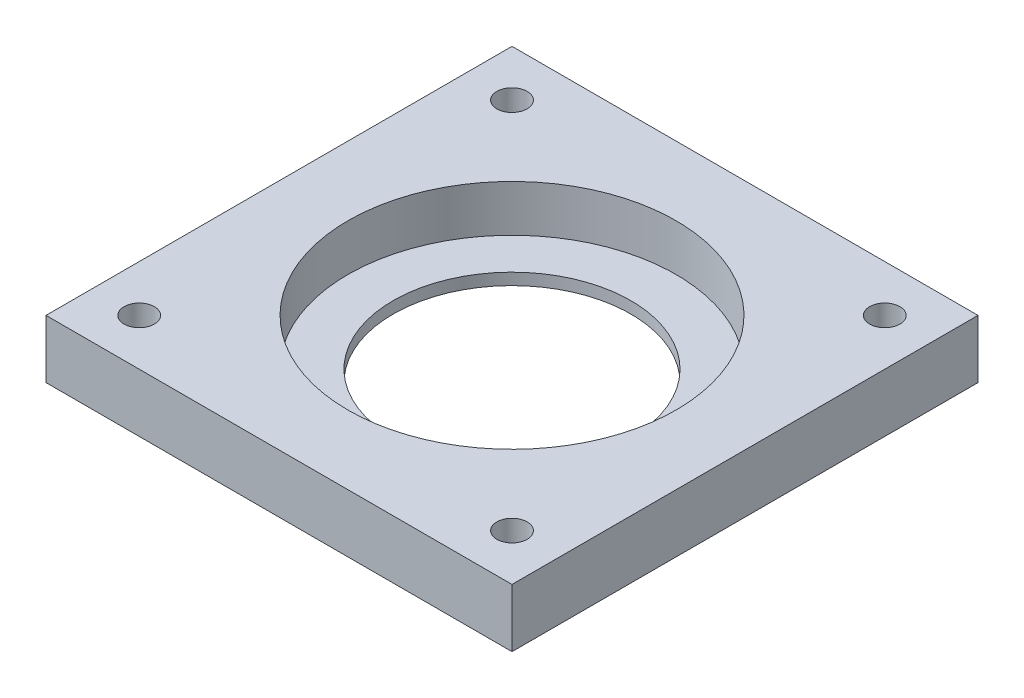
ISO-10303-21;
HEADER;
FILE_DESCRIPTION(('STEP AP214'),'2;1');
FILE_NAME('part.step','',(''),(''),'','','');
FILE_SCHEMA(('AUTOMOTIVE_DESIGN { 1 0 10303 214 1 1 1 1 }'));
ENDSEC;
DATA;
#1=APPLICATION_CONTEXT('core data for automotive mechanical design processes');
#2=APPLICATION_PROTOCOL_DEFINITION('international standard','automotive_design',2000,#1);
#3=PRODUCT_CONTEXT('',#1,'mechanical');
#4=PRODUCT('Part','Part','',(#3));
#5=PRODUCT_RELATED_PRODUCT_CATEGORY('part','',(#4));
#6=PRODUCT_DEFINITION_FORMATION('','',#4);
#7=PRODUCT_DEFINITION_CONTEXT('part definition',#1,'design');
#8=PRODUCT_DEFINITION('design','',#6,#7);
#9=PRODUCT_DEFINITION_SHAPE('','',#8);
#10=(LENGTH_UNIT() NAMED_UNIT(*) SI_UNIT(.MILLI.,.METRE.));
#11=(NAMED_UNIT(*) PLANE_ANGLE_UNIT() SI_UNIT($,.RADIAN.));
#12=(NAMED_UNIT(*) SI_UNIT($,.STERADIAN.) SOLID_ANGLE_UNIT());
#13=UNCERTAINTY_MEASURE_WITH_UNIT(LENGTH_MEASURE(1.E-05),#10,'distance_accuracy_value','');
#14=(GEOMETRIC_REPRESENTATION_CONTEXT(3) GLOBAL_UNCERTAINTY_ASSIGNED_CONTEXT((#13)) GLOBAL_UNIT_ASSIGNED_CONTEXT((#10,
#11,#12)) REPRESENTATION_CONTEXT('',''));
#15=CARTESIAN_POINT('',(0.,0.,0.));
#16=DIRECTION('',(0.,0.,1.));
#17=DIRECTION('',(1.,0.,0.));
#18=AXIS2_PLACEMENT_3D('',#15,#16,#17);
#19=CARTESIAN_POINT('',(50.,12.5,-50.));
#20=DIRECTION('',(-1.,0.,0.));
#21=DIRECTION('',(0.,0.,1.));
#22=AXIS2_PLACEMENT_3D('',#19,#20,#21);
#23=PLANE('',#22);
#24=DIRECTION('',(0.,0.,-1.));
#25=VECTOR('',#24,1.);
#26=CARTESIAN_POINT('',(50.,0.,-50.));
#27=LINE('',#26,#25);
#28=CARTESIAN_POINT('',(50.,0.,50.));
#29=VERTEX_POINT('',#28);
#30=CARTESIAN_POINT('',(50.,0.,-50.));
#31=VERTEX_POINT('',#30);
#32=EDGE_CURVE('E111',#29,#31,#27,.T.);
#33=ORIENTED_EDGE('',*,*,#32,.T.);
#34=DIRECTION('',(0.,-1.,0.));
#35=VECTOR('',#34,1.);
#36=CARTESIAN_POINT('',(50.,12.5,-50.));
#37=LINE('',#36,#35);
#38=CARTESIAN_POINT('',(50.,12.5,-50.));
#39=VERTEX_POINT('',#38);
#40=EDGE_CURVE('E11',#39,#31,#37,.T.);
#41=ORIENTED_EDGE('',*,*,#40,.F.);
#42=DIRECTION('',(0.,0.,-1.));
#43=VECTOR('',#42,1.);
#44=CARTESIAN_POINT('',(50.,12.5,-50.));
#45=LINE('',#44,#43);
#46=CARTESIAN_POINT('',(50.,12.5,50.));
#47=VERTEX_POINT('',#46);
#48=EDGE_CURVE('E95',#47,#39,#45,.T.);
#49=ORIENTED_EDGE('',*,*,#48,.F.);
#50=DIRECTION('',(0.,-1.,0.));
#51=VECTOR('',#50,1.);
#52=CARTESIAN_POINT('',(50.,12.5,50.));
#53=LINE('',#52,#51);
#54=EDGE_CURVE('E107',#47,#29,#53,.T.);
#55=ORIENTED_EDGE('',*,*,#54,.T.);
#56=EDGE_LOOP('',(#33,#41,#49,#55));
#57=FACE_BOUND('',#56,.T.);
#58=ADVANCED_FACE('F43',(#57),#23,.F.);
#59=CARTESIAN_POINT('',(-50.,12.5,-50.));
#60=DIRECTION('',(0.,0.,1.));
#61=DIRECTION('',(1.,0.,0.));
#62=AXIS2_PLACEMENT_3D('',#59,#60,#61);
#63=PLANE('',#62);
#64=DIRECTION('',(-1.,0.,0.));
#65=VECTOR('',#64,1.);
#66=CARTESIAN_POINT('',(-50.,0.,-50.));
#67=LINE('',#66,#65);
#68=CARTESIAN_POINT('',(-50.,0.,-50.));
#69=VERTEX_POINT('',#68);
#70=EDGE_CURVE('E100',#31,#69,#67,.T.);
#71=ORIENTED_EDGE('',*,*,#70,.T.);
#72=DIRECTION('',(0.,-1.,0.));
#73=VECTOR('',#72,1.);
#74=CARTESIAN_POINT('',(-50.,12.5,-50.));
#75=LINE('',#74,#73);
#76=CARTESIAN_POINT('',(-50.,12.5,-50.));
#77=VERTEX_POINT('',#76);
#78=EDGE_CURVE('E52',#77,#69,#75,.T.);
#79=ORIENTED_EDGE('',*,*,#78,.F.);
#80=DIRECTION('',(-1.,0.,0.));
#81=VECTOR('',#80,1.);
#82=CARTESIAN_POINT('',(-50.,12.5,-50.));
#83=LINE('',#82,#81);
#84=EDGE_CURVE('E90',#39,#77,#83,.T.);
#85=ORIENTED_EDGE('',*,*,#84,.F.);
#86=ORIENTED_EDGE('',*,*,#40,.T.);
#87=EDGE_LOOP('',(#71,#79,#85,#86));
#88=FACE_BOUND('',#87,.T.);
#89=ADVANCED_FACE('F99',(#88),#63,.F.);
#90=CARTESIAN_POINT('',(-50.,12.5,-50.));
#91=DIRECTION('',(1.,0.,0.));
#92=DIRECTION('',(0.,0.,-1.));
#93=AXIS2_PLACEMENT_3D('',#90,#91,#92);
#94=PLANE('',#93);
#95=DIRECTION('',(0.,0.,1.));
#96=VECTOR('',#95,1.);
#97=CARTESIAN_POINT('',(-50.,0.,-50.));
#98=LINE('',#97,#96);
#99=CARTESIAN_POINT('',(-50.,0.,50.));
#100=VERTEX_POINT('',#99);
#101=EDGE_CURVE('E77',#69,#100,#98,.T.);
#102=ORIENTED_EDGE('',*,*,#101,.T.);
#103=DIRECTION('',(0.,-1.,0.));
#104=VECTOR('',#103,1.);
#105=CARTESIAN_POINT('',(-50.,12.5,50.));
#106=LINE('',#105,#104);
#107=CARTESIAN_POINT('',(-50.,12.5,50.));
#108=VERTEX_POINT('',#107);
#109=EDGE_CURVE('E102',#108,#100,#106,.T.);
#110=ORIENTED_EDGE('',*,*,#109,.F.);
#111=DIRECTION('',(0.,0.,1.));
#112=VECTOR('',#111,1.);
#113=CARTESIAN_POINT('',(-50.,12.5,-50.));
#114=LINE('',#113,#112);
#115=EDGE_CURVE('E93',#77,#108,#114,.T.);
#116=ORIENTED_EDGE('',*,*,#115,.F.);
#117=ORIENTED_EDGE('',*,*,#78,.T.);
#118=EDGE_LOOP('',(#102,#110,#116,#117));
#119=FACE_BOUND('',#118,.T.);
#120=ADVANCED_FACE('F103',(#119),#94,.F.);
#121=CARTESIAN_POINT('',(-50.,12.5,50.));
#122=DIRECTION('',(0.,0.,-1.));
#123=DIRECTION('',(-1.,0.,0.));
#124=AXIS2_PLACEMENT_3D('',#121,#122,#123);
#125=PLANE('',#124);
#126=DIRECTION('',(1.,0.,0.));
#127=VECTOR('',#126,1.);
#128=CARTESIAN_POINT('',(-50.,0.,50.));
#129=LINE('',#128,#127);
#130=EDGE_CURVE('E83',#100,#29,#129,.T.);
#131=ORIENTED_EDGE('',*,*,#130,.T.);
#132=ORIENTED_EDGE('',*,*,#54,.F.);
#133=DIRECTION('',(1.,0.,0.));
#134=VECTOR('',#133,1.);
#135=CARTESIAN_POINT('',(-50.,12.5,50.));
#136=LINE('',#135,#134);
#137=EDGE_CURVE('E60',#108,#47,#136,.T.);
#138=ORIENTED_EDGE('',*,*,#137,.F.);
#139=ORIENTED_EDGE('',*,*,#109,.T.);
#140=EDGE_LOOP('',(#131,#132,#138,#139));
#141=FACE_BOUND('',#140,.T.);
#142=ADVANCED_FACE('F125',(#141),#125,.F.);
#143=CARTESIAN_POINT('',(0.,12.5,0.));
#144=DIRECTION('',(0.,1.,0.));
#145=DIRECTION('',(0.,0.,1.));
#146=AXIS2_PLACEMENT_3D('',#143,#144,#145);
#147=PLANE('',#146);
#148=CARTESIAN_POINT('',(-40.0000000000001,12.5,-39.9999999999999));
#149=DIRECTION('',(0.,1.,0.));
#150=DIRECTION('',(1.,0.,0.));
#151=AXIS2_PLACEMENT_3D('',#148,#149,#150);
#152=CIRCLE('',#151,3.25);
#153=CARTESIAN_POINT('',(-36.7500000000001,12.5,-39.9999999999999));
#154=VERTEX_POINT('',#153);
#155=EDGE_CURVE('E172',#154,#154,#152,.T.);
#156=ORIENTED_EDGE('',*,*,#155,.F.);
#157=EDGE_LOOP('',(#156));
#158=FACE_BOUND('',#157,.T.);
#159=CARTESIAN_POINT('',(-40.,12.5,40.));
#160=DIRECTION('',(0.,1.,0.));
#161=DIRECTION('',(0.,0.,-1.));
#162=AXIS2_PLACEMENT_3D('',#159,#160,#161);
#163=CIRCLE('',#162,3.25);
#164=CARTESIAN_POINT('',(-40.,12.5,36.75));
#165=VERTEX_POINT('',#164);
#166=EDGE_CURVE('E164',#165,#165,#163,.T.);
#167=ORIENTED_EDGE('',*,*,#166,.F.);
#168=EDGE_LOOP('',(#167));
#169=FACE_BOUND('',#168,.T.);
#170=CARTESIAN_POINT('',(40.0000000000004,12.5,39.9999999999996));
#171=DIRECTION('',(0.,1.,0.));
#172=DIRECTION('',(-1.,0.,0.));
#173=AXIS2_PLACEMENT_3D('',#170,#171,#172);
#174=CIRCLE('',#173,3.25);
#175=CARTESIAN_POINT('',(36.7500000000004,12.5,39.9999999999996));
#176=VERTEX_POINT('',#175);
#177=EDGE_CURVE('E156',#176,#176,#174,.T.);
#178=ORIENTED_EDGE('',*,*,#177,.F.);
#179=EDGE_LOOP('',(#178));
#180=FACE_BOUND('',#179,.T.);
#181=CARTESIAN_POINT('',(40.,12.5,-40.));
#182=DIRECTION('',(0.,1.,0.));
#183=DIRECTION('',(0.,0.,1.));
#184=AXIS2_PLACEMENT_3D('',#181,#182,#183);
#185=CIRCLE('',#184,3.25);
#186=CARTESIAN_POINT('',(40.,12.5,-36.75));
#187=VERTEX_POINT('',#186);
#188=EDGE_CURVE('E148',#187,#187,#185,.T.);
#189=ORIENTED_EDGE('',*,*,#188,.F.);
#190=EDGE_LOOP('',(#189));
#191=FACE_BOUND('',#190,.T.);
#192=CARTESIAN_POINT('',(0.,12.5,0.));
#193=DIRECTION('',(0.,1.,0.));
#194=DIRECTION('',(0.,0.,1.));
#195=AXIS2_PLACEMENT_3D('',#192,#193,#194);
#196=CIRCLE('',#195,35.2);
#197=CARTESIAN_POINT('',(0.,12.5,35.2));
#198=VERTEX_POINT('',#197);
#199=EDGE_CURVE('E132',#198,#198,#196,.T.);
#200=ORIENTED_EDGE('',*,*,#199,.F.);
#201=EDGE_LOOP('',(#200));
#202=FACE_BOUND('',#201,.T.);
#203=ORIENTED_EDGE('',*,*,#48,.T.);
#204=ORIENTED_EDGE('',*,*,#84,.T.);
#205=ORIENTED_EDGE('',*,*,#115,.T.);
#206=ORIENTED_EDGE('',*,*,#137,.T.);
#207=EDGE_LOOP('',(#203,#204,#205,#206));
#208=FACE_BOUND('',#207,.T.);
#209=ADVANCED_FACE('F91',(#158,#169,#180,#191,#202,#208),#147,.T.);
#210=CARTESIAN_POINT('',(0.,0.,0.));
#211=DIRECTION('',(0.,1.,0.));
#212=DIRECTION('',(0.,0.,1.));
#213=AXIS2_PLACEMENT_3D('',#210,#211,#212);
#214=PLANE('',#213);
#215=CARTESIAN_POINT('',(-40.0000000000001,0.,-39.9999999999999));
#216=DIRECTION('',(0.,1.,0.));
#217=DIRECTION('',(1.,0.,0.));
#218=AXIS2_PLACEMENT_3D('',#215,#216,#217);
#219=CIRCLE('',#218,3.25);
#220=CARTESIAN_POINT('',(-36.7500000000001,0.,-39.9999999999999));
#221=VERTEX_POINT('',#220);
#222=EDGE_CURVE('E152',#221,#221,#219,.T.);
#223=ORIENTED_EDGE('',*,*,#222,.T.);
#224=EDGE_LOOP('',(#223));
#225=FACE_BOUND('',#224,.T.);
#226=CARTESIAN_POINT('',(-40.,0.,40.));
#227=DIRECTION('',(0.,1.,0.));
#228=DIRECTION('',(0.,0.,-1.));
#229=AXIS2_PLACEMENT_3D('',#226,#227,#228);
#230=CIRCLE('',#229,3.25);
#231=CARTESIAN_POINT('',(-40.,0.,36.75));
#232=VERTEX_POINT('',#231);
#233=EDGE_CURVE('E168',#232,#232,#230,.T.);
#234=ORIENTED_EDGE('',*,*,#233,.T.);
#235=EDGE_LOOP('',(#234));
#236=FACE_BOUND('',#235,.T.);
#237=CARTESIAN_POINT('',(40.0000000000004,0.,39.9999999999996));
#238=DIRECTION('',(0.,1.,0.));
#239=DIRECTION('',(-1.,0.,0.));
#240=AXIS2_PLACEMENT_3D('',#237,#238,#239);
#241=CIRCLE('',#240,3.25);
#242=CARTESIAN_POINT('',(36.7500000000004,0.,39.9999999999996));
#243=VERTEX_POINT('',#242);
#244=EDGE_CURVE('E160',#243,#243,#241,.T.);
#245=ORIENTED_EDGE('',*,*,#244,.T.);
#246=EDGE_LOOP('',(#245));
#247=FACE_BOUND('',#246,.T.);
#248=CARTESIAN_POINT('',(40.,0.,-40.));
#249=DIRECTION('',(0.,1.,0.));
#250=DIRECTION('',(0.,0.,1.));
#251=AXIS2_PLACEMENT_3D('',#248,#249,#250);
#252=CIRCLE('',#251,3.25);
#253=CARTESIAN_POINT('',(40.,0.,-36.75));
#254=VERTEX_POINT('',#253);
#255=EDGE_CURVE('E144',#254,#254,#252,.T.);
#256=ORIENTED_EDGE('',*,*,#255,.T.);
#257=EDGE_LOOP('',(#256));
#258=FACE_BOUND('',#257,.T.);
#259=CARTESIAN_POINT('',(0.,0.,0.));
#260=DIRECTION('',(0.,1.,0.));
#261=DIRECTION('',(0.,0.,1.));
#262=AXIS2_PLACEMENT_3D('',#259,#260,#261);
#263=CIRCLE('',#262,25.5);
#264=CARTESIAN_POINT('',(0.,0.,25.5));
#265=VERTEX_POINT('',#264);
#266=EDGE_CURVE('E136',#265,#265,#263,.T.);
#267=ORIENTED_EDGE('',*,*,#266,.T.);
#268=EDGE_LOOP('',(#267));
#269=FACE_BOUND('',#268,.T.);
#270=ORIENTED_EDGE('',*,*,#32,.F.);
#271=ORIENTED_EDGE('',*,*,#130,.F.);
#272=ORIENTED_EDGE('',*,*,#101,.F.);
#273=ORIENTED_EDGE('',*,*,#70,.F.);
#274=EDGE_LOOP('',(#270,#271,#272,#273));
#275=FACE_BOUND('',#274,.T.);
#276=ADVANCED_FACE('F128',(#225,#236,#247,#258,#269,#275),#214,.F.);
#277=CARTESIAN_POINT('',(0.,2.5,0.));
#278=DIRECTION('',(0.,1.,0.));
#279=DIRECTION('',(0.,0.,1.));
#280=AXIS2_PLACEMENT_3D('',#277,#278,#279);
#281=CYLINDRICAL_SURFACE('',#280,35.2);
#282=CARTESIAN_POINT('',(0.,2.5,0.));
#283=DIRECTION('',(0.,1.,0.));
#284=DIRECTION('',(0.,0.,1.));
#285=AXIS2_PLACEMENT_3D('',#282,#283,#284);
#286=CIRCLE('',#285,35.2);
#287=CARTESIAN_POINT('',(0.,2.5,35.2));
#288=VERTEX_POINT('',#287);
#289=EDGE_CURVE('E115',#288,#288,#286,.T.);
#290=ORIENTED_EDGE('',*,*,#289,.F.);
#291=EDGE_LOOP('',(#290));
#292=FACE_BOUND('',#291,.T.);
#293=ORIENTED_EDGE('',*,*,#199,.T.);
#294=EDGE_LOOP('',(#293));
#295=FACE_BOUND('',#294,.T.);
#296=ADVANCED_FACE('F200',(#292,#295),#281,.F.);
#297=CARTESIAN_POINT('',(0.,2.5,0.));
#298=DIRECTION('',(0.,1.,0.));
#299=DIRECTION('',(0.,0.,1.));
#300=AXIS2_PLACEMENT_3D('',#297,#298,#299);
#301=PLANE('',#300);
#302=CARTESIAN_POINT('',(0.,2.5,0.));
#303=DIRECTION('',(0.,1.,0.));
#304=DIRECTION('',(0.,0.,1.));
#305=AXIS2_PLACEMENT_3D('',#302,#303,#304);
#306=CIRCLE('',#305,25.5);
#307=CARTESIAN_POINT('',(0.,2.5,25.5));
#308=VERTEX_POINT('',#307);
#309=EDGE_CURVE('E140',#308,#308,#306,.T.);
#310=ORIENTED_EDGE('',*,*,#309,.F.);
#311=EDGE_LOOP('',(#310));
#312=FACE_BOUND('',#311,.T.);
#313=ORIENTED_EDGE('',*,*,#289,.T.);
#314=EDGE_LOOP('',(#313));
#315=FACE_BOUND('',#314,.T.);
#316=ADVANCED_FACE('F202',(#312,#315),#301,.T.);
#317=CARTESIAN_POINT('',(0.,0.,0.));
#318=DIRECTION('',(0.,1.,0.));
#319=DIRECTION('',(0.,0.,1.));
#320=AXIS2_PLACEMENT_3D('',#317,#318,#319);
#321=CYLINDRICAL_SURFACE('',#320,25.5);
#322=ORIENTED_EDGE('',*,*,#266,.F.);
#323=EDGE_LOOP('',(#322));
#324=FACE_BOUND('',#323,.T.);
#325=ORIENTED_EDGE('',*,*,#309,.T.);
#326=EDGE_LOOP('',(#325));
#327=FACE_BOUND('',#326,.T.);
#328=ADVANCED_FACE('F209',(#324,#327),#321,.F.);
#329=CARTESIAN_POINT('',(40.,0.,-40.));
#330=DIRECTION('',(0.,1.,0.));
#331=DIRECTION('',(0.,0.,1.));
#332=AXIS2_PLACEMENT_3D('',#329,#330,#331);
#333=CYLINDRICAL_SURFACE('',#332,3.25);
#334=ORIENTED_EDGE('',*,*,#255,.F.);
#335=EDGE_LOOP('',(#334));
#336=FACE_BOUND('',#335,.T.);
#337=ORIENTED_EDGE('',*,*,#188,.T.);
#338=EDGE_LOOP('',(#337));
#339=FACE_BOUND('',#338,.T.);
#340=ADVANCED_FACE('F249',(#336,#339),#333,.F.);
#341=CARTESIAN_POINT('',(40.0000000000004,0.,39.9999999999996));
#342=DIRECTION('',(0.,1.,0.));
#343=DIRECTION('',(0.,0.,1.));
#344=AXIS2_PLACEMENT_3D('',#341,#342,#343);
#345=CYLINDRICAL_SURFACE('',#344,3.25);
#346=ORIENTED_EDGE('',*,*,#244,.F.);
#347=EDGE_LOOP('',(#346));
#348=FACE_BOUND('',#347,.T.);
#349=ORIENTED_EDGE('',*,*,#177,.T.);
#350=EDGE_LOOP('',(#349));
#351=FACE_BOUND('',#350,.T.);
#352=ADVANCED_FACE('F244',(#348,#351),#345,.F.);
#353=CARTESIAN_POINT('',(-40.,0.,40.));
#354=DIRECTION('',(0.,1.,0.));
#355=DIRECTION('',(0.,0.,1.));
#356=AXIS2_PLACEMENT_3D('',#353,#354,#355);
#357=CYLINDRICAL_SURFACE('',#356,3.25);
#358=ORIENTED_EDGE('',*,*,#233,.F.);
#359=EDGE_LOOP('',(#358));
#360=FACE_BOUND('',#359,.T.);
#361=ORIENTED_EDGE('',*,*,#166,.T.);
#362=EDGE_LOOP('',(#361));
#363=FACE_BOUND('',#362,.T.);
#364=ADVANCED_FACE('F185',(#360,#363),#357,.F.);
#365=CARTESIAN_POINT('',(-40.0000000000001,0.,-39.9999999999999));
#366=DIRECTION('',(0.,1.,0.));
#367=DIRECTION('',(0.,0.,1.));
#368=AXIS2_PLACEMENT_3D('',#365,#366,#367);
#369=CYLINDRICAL_SURFACE('',#368,3.25);
#370=ORIENTED_EDGE('',*,*,#222,.F.);
#371=EDGE_LOOP('',(#370));
#372=FACE_BOUND('',#371,.T.);
#373=ORIENTED_EDGE('',*,*,#155,.T.);
#374=EDGE_LOOP('',(#373));
#375=FACE_BOUND('',#374,.T.);
#376=ADVANCED_FACE('F182',(#372,#375),#369,.F.);
#377=CLOSED_SHELL('',(#58,#89,#120,#142,#209,#276,#296,#316,#328,#340,#352,#364,#376));
#378=MANIFOLD_SOLID_BREP('B2',#377);
#379=ADVANCED_BREP_SHAPE_REPRESENTATION('',(#18,#378),#14);
#380=SHAPE_DEFINITION_REPRESENTATION(#9,#379);
ENDSEC;
END-ISO-10303-21;
